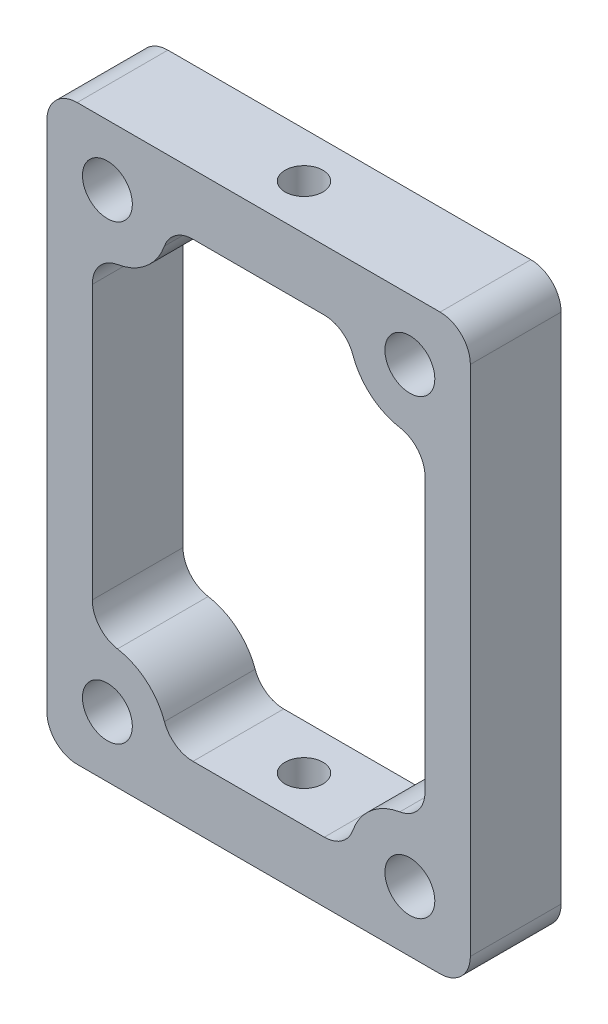
ISO-10303-21;
HEADER;
FILE_DESCRIPTION(('STEP AP214'),'2;1');
FILE_NAME('part.step','',(''),(''),'','','');
FILE_SCHEMA(('AUTOMOTIVE_DESIGN { 1 0 10303 214 1 1 1 1 }'));
ENDSEC;
DATA;
#1=APPLICATION_CONTEXT('core data for automotive mechanical design processes');
#2=APPLICATION_PROTOCOL_DEFINITION('international standard','automotive_design',2000,#1);
#3=PRODUCT_CONTEXT('',#1,'mechanical');
#4=PRODUCT('Part','Part','',(#3));
#5=PRODUCT_RELATED_PRODUCT_CATEGORY('part','',(#4));
#6=PRODUCT_DEFINITION_FORMATION('','',#4);
#7=PRODUCT_DEFINITION_CONTEXT('part definition',#1,'design');
#8=PRODUCT_DEFINITION('design','',#6,#7);
#9=PRODUCT_DEFINITION_SHAPE('','',#8);
#10=(LENGTH_UNIT() NAMED_UNIT(*) SI_UNIT(.MILLI.,.METRE.));
#11=(NAMED_UNIT(*) PLANE_ANGLE_UNIT() SI_UNIT($,.RADIAN.));
#12=(NAMED_UNIT(*) SI_UNIT($,.STERADIAN.) SOLID_ANGLE_UNIT());
#13=UNCERTAINTY_MEASURE_WITH_UNIT(LENGTH_MEASURE(1.E-05),#10,'distance_accuracy_value','');
#14=(GEOMETRIC_REPRESENTATION_CONTEXT(3) GLOBAL_UNCERTAINTY_ASSIGNED_CONTEXT((#13)) GLOBAL_UNIT_ASSIGNED_CONTEXT((#10,
#11,#12)) REPRESENTATION_CONTEXT('',''));
#15=CARTESIAN_POINT('',(0.,0.,0.));
#16=DIRECTION('',(0.,0.,1.));
#17=DIRECTION('',(1.,0.,0.));
#18=AXIS2_PLACEMENT_3D('',#15,#16,#17);
#19=CARTESIAN_POINT('',(0.,0.,3.));
#20=DIRECTION('',(0.,0.,-1.));
#21=DIRECTION('',(-1.,0.,0.));
#22=AXIS2_PLACEMENT_3D('',#19,#20,#21);
#23=PLANE('',#22);
#24=DIRECTION('',(1.,0.,0.));
#25=VECTOR('',#24,1.);
#26=CARTESIAN_POINT('',(-14.,-18.95,3.));
#27=LINE('',#26,#25);
#28=CARTESIAN_POINT('',(-12.,-18.95,3.));
#29=VERTEX_POINT('',#28);
#30=CARTESIAN_POINT('',(12.,-18.95,3.));
#31=VERTEX_POINT('',#30);
#32=EDGE_CURVE('E237',#29,#31,#27,.T.);
#33=ORIENTED_EDGE('',*,*,#32,.T.);
#34=CARTESIAN_POINT('',(12.,-16.95,3.));
#35=DIRECTION('',(0.,0.,-1.));
#36=DIRECTION('',(-1.,0.,0.));
#37=AXIS2_PLACEMENT_3D('',#34,#35,#36);
#38=CIRCLE('',#37,2.);
#39=CARTESIAN_POINT('',(14.,-16.95,3.));
#40=VERTEX_POINT('',#39);
#41=EDGE_CURVE('E274',#31,#40,#38,.F.);
#42=ORIENTED_EDGE('',*,*,#41,.T.);
#43=DIRECTION('',(0.,1.,0.));
#44=VECTOR('',#43,1.);
#45=CARTESIAN_POINT('',(14.,-18.95,3.));
#46=LINE('',#45,#44);
#47=CARTESIAN_POINT('',(14.,16.95,3.));
#48=VERTEX_POINT('',#47);
#49=EDGE_CURVE('E221',#40,#48,#46,.T.);
#50=ORIENTED_EDGE('',*,*,#49,.T.);
#51=CARTESIAN_POINT('',(12.,16.95,3.));
#52=DIRECTION('',(0.,0.,-1.));
#53=DIRECTION('',(-1.,0.,0.));
#54=AXIS2_PLACEMENT_3D('',#51,#52,#53);
#55=CIRCLE('',#54,2.);
#56=CARTESIAN_POINT('',(12.,18.95,3.));
#57=VERTEX_POINT('',#56);
#58=EDGE_CURVE('E268',#48,#57,#55,.F.);
#59=ORIENTED_EDGE('',*,*,#58,.T.);
#60=DIRECTION('',(-1.,0.,0.));
#61=VECTOR('',#60,1.);
#62=CARTESIAN_POINT('',(-14.,18.95,3.));
#63=LINE('',#62,#61);
#64=CARTESIAN_POINT('',(-12.,18.95,3.));
#65=VERTEX_POINT('',#64);
#66=EDGE_CURVE('E470',#57,#65,#63,.T.);
#67=ORIENTED_EDGE('',*,*,#66,.T.);
#68=CARTESIAN_POINT('',(-12.,16.95,3.));
#69=DIRECTION('',(0.,0.,-1.));
#70=DIRECTION('',(-1.,0.,0.));
#71=AXIS2_PLACEMENT_3D('',#68,#69,#70);
#72=CIRCLE('',#71,2.);
#73=CARTESIAN_POINT('',(-14.,16.95,3.));
#74=VERTEX_POINT('',#73);
#75=EDGE_CURVE('E270',#65,#74,#72,.F.);
#76=ORIENTED_EDGE('',*,*,#75,.T.);
#77=DIRECTION('',(0.,-1.,0.));
#78=VECTOR('',#77,1.);
#79=CARTESIAN_POINT('',(-14.,-18.95,3.));
#80=LINE('',#79,#78);
#81=CARTESIAN_POINT('',(-14.,-16.95,3.));
#82=VERTEX_POINT('',#81);
#83=EDGE_CURVE('E472',#74,#82,#80,.T.);
#84=ORIENTED_EDGE('',*,*,#83,.T.);
#85=CARTESIAN_POINT('',(-12.,-16.95,3.));
#86=DIRECTION('',(0.,0.,-1.));
#87=DIRECTION('',(-1.,0.,0.));
#88=AXIS2_PLACEMENT_3D('',#85,#86,#87);
#89=CIRCLE('',#88,2.);
#90=EDGE_CURVE('E272',#82,#29,#89,.F.);
#91=ORIENTED_EDGE('',*,*,#90,.T.);
#92=EDGE_LOOP('',(#33,#42,#50,#59,#67,#76,#84,#91));
#93=FACE_BOUND('',#92,.T.);
#94=CARTESIAN_POINT('',(-9.99999999999999,-14.95,3.));
#95=DIRECTION('',(0.,0.,1.));
#96=DIRECTION('',(1.,0.,0.));
#97=AXIS2_PLACEMENT_3D('',#94,#95,#96);
#98=CIRCLE('',#97,1.64999999999999);
#99=CARTESIAN_POINT('',(-8.35000000000001,-14.95,3.));
#100=VERTEX_POINT('',#99);
#101=EDGE_CURVE('E234',#100,#100,#98,.T.);
#102=ORIENTED_EDGE('',*,*,#101,.F.);
#103=EDGE_LOOP('',(#102));
#104=FACE_BOUND('',#103,.T.);
#105=CARTESIAN_POINT('',(9.99999999999999,-14.95,3.));
#106=DIRECTION('',(0.,0.,1.));
#107=DIRECTION('',(1.,0.,0.));
#108=AXIS2_PLACEMENT_3D('',#105,#106,#107);
#109=CIRCLE('',#108,1.64999999999999);
#110=CARTESIAN_POINT('',(11.65,-14.95,3.));
#111=VERTEX_POINT('',#110);
#112=EDGE_CURVE('E461',#111,#111,#109,.T.);
#113=ORIENTED_EDGE('',*,*,#112,.F.);
#114=EDGE_LOOP('',(#113));
#115=FACE_BOUND('',#114,.T.);
#116=CARTESIAN_POINT('',(9.99999999999999,14.95,3.));
#117=DIRECTION('',(0.,0.,1.));
#118=DIRECTION('',(1.,0.,0.));
#119=AXIS2_PLACEMENT_3D('',#116,#117,#118);
#120=CIRCLE('',#119,1.64999999999999);
#121=CARTESIAN_POINT('',(11.65,14.95,3.));
#122=VERTEX_POINT('',#121);
#123=EDGE_CURVE('E455',#122,#122,#120,.T.);
#124=ORIENTED_EDGE('',*,*,#123,.F.);
#125=EDGE_LOOP('',(#124));
#126=FACE_BOUND('',#125,.T.);
#127=CARTESIAN_POINT('',(-9.99999999999999,14.95,3.));
#128=DIRECTION('',(0.,0.,1.));
#129=DIRECTION('',(1.,0.,0.));
#130=AXIS2_PLACEMENT_3D('',#127,#128,#129);
#131=CIRCLE('',#130,1.64999999999999);
#132=CARTESIAN_POINT('',(-8.35000000000001,14.95,3.));
#133=VERTEX_POINT('',#132);
#134=EDGE_CURVE('E449',#133,#133,#131,.T.);
#135=ORIENTED_EDGE('',*,*,#134,.F.);
#136=EDGE_LOOP('',(#135));
#137=FACE_BOUND('',#136,.T.);
#138=DIRECTION('',(0.,-1.,0.));
#139=VECTOR('',#138,1.);
#140=CARTESIAN_POINT('',(-11.,11.0770166537926,3.));
#141=LINE('',#140,#139);
#142=CARTESIAN_POINT('',(-11.,9.03392021690037,3.));
#143=VERTEX_POINT('',#142);
#144=CARTESIAN_POINT('',(-11.,-9.03392021690038,3.));
#145=VERTEX_POINT('',#144);
#146=EDGE_CURVE('E363',#143,#145,#141,.T.);
#147=ORIENTED_EDGE('',*,*,#146,.F.);
#148=CARTESIAN_POINT('',(-8.99999999999999,9.03392021690037,3.));
#149=DIRECTION('',(0.,0.,-1.));
#150=DIRECTION('',(-1.,0.,0.));
#151=AXIS2_PLACEMENT_3D('',#148,#149,#150);
#152=CIRCLE('',#151,2.);
#153=CARTESIAN_POINT('',(-9.33333333333332,11.0059468112669,3.));
#154=VERTEX_POINT('',#153);
#155=EDGE_CURVE('E47',#143,#154,#152,.T.);
#156=ORIENTED_EDGE('',*,*,#155,.T.);
#157=CARTESIAN_POINT('',(-9.99999999999999,14.95,3.));
#158=DIRECTION('',(0.,0.,1.));
#159=DIRECTION('',(1.,0.,0.));
#160=AXIS2_PLACEMENT_3D('',#157,#158,#159);
#161=CIRCLE('',#160,4.00000000000001);
#162=CARTESIAN_POINT('',(-6.22876383367173,13.6166666666667,3.));
#163=VERTEX_POINT('',#162);
#164=EDGE_CURVE('E361',#154,#163,#161,.T.);
#165=ORIENTED_EDGE('',*,*,#164,.T.);
#166=CARTESIAN_POINT('',(-4.3431457505076,12.95,3.));
#167=DIRECTION('',(0.,0.,-1.));
#168=DIRECTION('',(-1.,0.,0.));
#169=AXIS2_PLACEMENT_3D('',#166,#167,#168);
#170=CIRCLE('',#169,2.);
#171=CARTESIAN_POINT('',(-4.3431457505076,14.95,3.));
#172=VERTEX_POINT('',#171);
#173=EDGE_CURVE('E355',#163,#172,#170,.T.);
#174=ORIENTED_EDGE('',*,*,#173,.T.);
#175=DIRECTION('',(1.,0.,0.));
#176=VECTOR('',#175,1.);
#177=CARTESIAN_POINT('',(0.,14.95,3.));
#178=LINE('',#177,#176);
#179=CARTESIAN_POINT('',(4.3431457505076,14.95,3.));
#180=VERTEX_POINT('',#179);
#181=EDGE_CURVE('E369',#172,#180,#178,.T.);
#182=ORIENTED_EDGE('',*,*,#181,.T.);
#183=CARTESIAN_POINT('',(4.3431457505076,12.95,3.));
#184=DIRECTION('',(0.,0.,-1.));
#185=DIRECTION('',(-1.,0.,0.));
#186=AXIS2_PLACEMENT_3D('',#183,#184,#185);
#187=CIRCLE('',#186,2.);
#188=CARTESIAN_POINT('',(6.22876383367173,13.6166666666667,3.));
#189=VERTEX_POINT('',#188);
#190=EDGE_CURVE('E331',#180,#189,#187,.T.);
#191=ORIENTED_EDGE('',*,*,#190,.T.);
#192=CARTESIAN_POINT('',(9.99999999999999,14.95,3.));
#193=DIRECTION('',(0.,0.,1.));
#194=DIRECTION('',(1.,0.,0.));
#195=AXIS2_PLACEMENT_3D('',#192,#193,#194);
#196=CIRCLE('',#195,4.00000000000001);
#197=CARTESIAN_POINT('',(9.33333333333332,11.0059468112669,3.));
#198=VERTEX_POINT('',#197);
#199=EDGE_CURVE('E431',#189,#198,#196,.T.);
#200=ORIENTED_EDGE('',*,*,#199,.T.);
#201=CARTESIAN_POINT('',(8.99999999999999,9.03392021690037,3.));
#202=DIRECTION('',(0.,0.,-1.));
#203=DIRECTION('',(-1.,0.,0.));
#204=AXIS2_PLACEMENT_3D('',#201,#202,#203);
#205=CIRCLE('',#204,2.);
#206=CARTESIAN_POINT('',(11.,9.03392021690037,3.));
#207=VERTEX_POINT('',#206);
#208=EDGE_CURVE('E335',#198,#207,#205,.T.);
#209=ORIENTED_EDGE('',*,*,#208,.T.);
#210=DIRECTION('',(0.,1.,0.));
#211=VECTOR('',#210,1.);
#212=CARTESIAN_POINT('',(11.,11.0770166537926,3.));
#213=LINE('',#212,#211);
#214=CARTESIAN_POINT('',(11.,-9.03392021690038,3.));
#215=VERTEX_POINT('',#214);
#216=EDGE_CURVE('E420',#215,#207,#213,.T.);
#217=ORIENTED_EDGE('',*,*,#216,.F.);
#218=CARTESIAN_POINT('',(8.99999999999999,-9.03392021690038,3.));
#219=DIRECTION('',(0.,0.,-1.));
#220=DIRECTION('',(-1.,0.,0.));
#221=AXIS2_PLACEMENT_3D('',#218,#219,#220);
#222=CIRCLE('',#221,2.);
#223=CARTESIAN_POINT('',(9.33333333333333,-11.0059468112669,3.));
#224=VERTEX_POINT('',#223);
#225=EDGE_CURVE('E339',#215,#224,#222,.T.);
#226=ORIENTED_EDGE('',*,*,#225,.T.);
#227=CARTESIAN_POINT('',(9.99999999999999,-14.95,3.));
#228=DIRECTION('',(0.,0.,1.));
#229=DIRECTION('',(1.,0.,0.));
#230=AXIS2_PLACEMENT_3D('',#227,#228,#229);
#231=CIRCLE('',#230,4.);
#232=CARTESIAN_POINT('',(6.22876383367174,-13.6166666666667,3.));
#233=VERTEX_POINT('',#232);
#234=EDGE_CURVE('E409',#224,#233,#231,.T.);
#235=ORIENTED_EDGE('',*,*,#234,.T.);
#236=CARTESIAN_POINT('',(4.34314575050761,-12.95,3.));
#237=DIRECTION('',(0.,0.,-1.));
#238=DIRECTION('',(-1.,0.,0.));
#239=AXIS2_PLACEMENT_3D('',#236,#237,#238);
#240=CIRCLE('',#239,2.);
#241=CARTESIAN_POINT('',(4.34314575050761,-14.95,3.));
#242=VERTEX_POINT('',#241);
#243=EDGE_CURVE('E343',#233,#242,#240,.T.);
#244=ORIENTED_EDGE('',*,*,#243,.T.);
#245=DIRECTION('',(1.,0.,0.));
#246=VECTOR('',#245,1.);
#247=CARTESIAN_POINT('',(0.,-14.95,3.));
#248=LINE('',#247,#246);
#249=CARTESIAN_POINT('',(-4.34314575050761,-14.95,3.));
#250=VERTEX_POINT('',#249);
#251=EDGE_CURVE('E398',#250,#242,#248,.T.);
#252=ORIENTED_EDGE('',*,*,#251,.F.);
#253=CARTESIAN_POINT('',(-4.34314575050761,-12.95,3.));
#254=DIRECTION('',(0.,0.,-1.));
#255=DIRECTION('',(-1.,0.,0.));
#256=AXIS2_PLACEMENT_3D('',#253,#254,#255);
#257=CIRCLE('',#256,2.);
#258=CARTESIAN_POINT('',(-6.22876383367174,-13.6166666666667,3.));
#259=VERTEX_POINT('',#258);
#260=EDGE_CURVE('E347',#250,#259,#257,.T.);
#261=ORIENTED_EDGE('',*,*,#260,.T.);
#262=CARTESIAN_POINT('',(-9.99999999999999,-14.95,3.));
#263=DIRECTION('',(0.,0.,1.));
#264=DIRECTION('',(1.,0.,0.));
#265=AXIS2_PLACEMENT_3D('',#262,#263,#264);
#266=CIRCLE('',#265,4.);
#267=CARTESIAN_POINT('',(-9.33333333333333,-11.0059468112669,3.));
#268=VERTEX_POINT('',#267);
#269=EDGE_CURVE('E368',#259,#268,#266,.T.);
#270=ORIENTED_EDGE('',*,*,#269,.T.);
#271=CARTESIAN_POINT('',(-8.99999999999999,-9.03392021690038,3.));
#272=DIRECTION('',(0.,0.,-1.));
#273=DIRECTION('',(-1.,0.,0.));
#274=AXIS2_PLACEMENT_3D('',#271,#272,#273);
#275=CIRCLE('',#274,2.);
#276=EDGE_CURVE('E351',#268,#145,#275,.T.);
#277=ORIENTED_EDGE('',*,*,#276,.T.);
#278=EDGE_LOOP('',(#147,#156,#165,#174,#182,#191,#200,#209,#217,#226,#235,#244,#252,#261,#270,#277));
#279=FACE_BOUND('',#278,.T.);
#280=ADVANCED_FACE('F38',(#93,#104,#115,#126,#137,#279),#23,.F.);
#281=CARTESIAN_POINT('',(0.,0.,-3.));
#282=DIRECTION('',(0.,0.,-1.));
#283=DIRECTION('',(-1.,0.,0.));
#284=AXIS2_PLACEMENT_3D('',#281,#282,#283);
#285=PLANE('',#284);
#286=DIRECTION('',(-1.,0.,0.));
#287=VECTOR('',#286,1.);
#288=CARTESIAN_POINT('',(0.,14.95,-3.));
#289=LINE('',#288,#287);
#290=CARTESIAN_POINT('',(4.3431457505076,14.95,-3.));
#291=VERTEX_POINT('',#290);
#292=CARTESIAN_POINT('',(-4.3431457505076,14.95,-3.));
#293=VERTEX_POINT('',#292);
#294=EDGE_CURVE('E247',#291,#293,#289,.T.);
#295=ORIENTED_EDGE('',*,*,#294,.T.);
#296=CARTESIAN_POINT('',(-4.3431457505076,12.95,-3.));
#297=DIRECTION('',(0.,0.,-1.));
#298=DIRECTION('',(-1.,0.,0.));
#299=AXIS2_PLACEMENT_3D('',#296,#297,#298);
#300=CIRCLE('',#299,2.);
#301=CARTESIAN_POINT('',(-6.22876383367173,13.6166666666667,-3.));
#302=VERTEX_POINT('',#301);
#303=EDGE_CURVE('E61',#293,#302,#300,.F.);
#304=ORIENTED_EDGE('',*,*,#303,.T.);
#305=CARTESIAN_POINT('',(-9.99999999999999,14.95,-3.));
#306=DIRECTION('',(0.,0.,-1.));
#307=DIRECTION('',(-1.,0.,0.));
#308=AXIS2_PLACEMENT_3D('',#305,#306,#307);
#309=CIRCLE('',#308,4.00000000000001);
#310=CARTESIAN_POINT('',(-9.33333333333332,11.0059468112669,-3.));
#311=VERTEX_POINT('',#310);
#312=EDGE_CURVE('E249',#302,#311,#309,.T.);
#313=ORIENTED_EDGE('',*,*,#312,.T.);
#314=CARTESIAN_POINT('',(-8.99999999999999,9.03392021690037,-3.));
#315=DIRECTION('',(0.,0.,-1.));
#316=DIRECTION('',(-1.,0.,0.));
#317=AXIS2_PLACEMENT_3D('',#314,#315,#316);
#318=CIRCLE('',#317,2.);
#319=CARTESIAN_POINT('',(-11.,9.03392021690037,-3.));
#320=VERTEX_POINT('',#319);
#321=EDGE_CURVE('E11',#311,#320,#318,.F.);
#322=ORIENTED_EDGE('',*,*,#321,.T.);
#323=DIRECTION('',(0.,1.,0.));
#324=VECTOR('',#323,1.);
#325=CARTESIAN_POINT('',(-11.,0.,-3.));
#326=LINE('',#325,#324);
#327=CARTESIAN_POINT('',(-11.,-9.03392021690038,-3.));
#328=VERTEX_POINT('',#327);
#329=EDGE_CURVE('E289',#328,#320,#326,.T.);
#330=ORIENTED_EDGE('',*,*,#329,.F.);
#331=CARTESIAN_POINT('',(-8.99999999999999,-9.03392021690038,-3.));
#332=DIRECTION('',(0.,0.,-1.));
#333=DIRECTION('',(-1.,0.,0.));
#334=AXIS2_PLACEMENT_3D('',#331,#332,#333);
#335=CIRCLE('',#334,2.);
#336=CARTESIAN_POINT('',(-9.33333333333333,-11.0059468112669,-3.));
#337=VERTEX_POINT('',#336);
#338=EDGE_CURVE('E353',#328,#337,#335,.F.);
#339=ORIENTED_EDGE('',*,*,#338,.T.);
#340=CARTESIAN_POINT('',(-9.99999999999999,-14.95,-3.));
#341=DIRECTION('',(0.,0.,-1.));
#342=DIRECTION('',(-1.,0.,0.));
#343=AXIS2_PLACEMENT_3D('',#340,#341,#342);
#344=CIRCLE('',#343,4.);
#345=CARTESIAN_POINT('',(-6.22876383367174,-13.6166666666667,-3.));
#346=VERTEX_POINT('',#345);
#347=EDGE_CURVE('E251',#337,#346,#344,.T.);
#348=ORIENTED_EDGE('',*,*,#347,.T.);
#349=CARTESIAN_POINT('',(-4.34314575050761,-12.95,-3.));
#350=DIRECTION('',(0.,0.,-1.));
#351=DIRECTION('',(-1.,0.,0.));
#352=AXIS2_PLACEMENT_3D('',#349,#350,#351);
#353=CIRCLE('',#352,2.);
#354=CARTESIAN_POINT('',(-4.34314575050761,-14.95,-3.));
#355=VERTEX_POINT('',#354);
#356=EDGE_CURVE('E349',#346,#355,#353,.F.);
#357=ORIENTED_EDGE('',*,*,#356,.T.);
#358=DIRECTION('',(-1.,0.,0.));
#359=VECTOR('',#358,1.);
#360=CARTESIAN_POINT('',(0.,-14.95,-3.));
#361=LINE('',#360,#359);
#362=CARTESIAN_POINT('',(4.34314575050761,-14.95,-3.));
#363=VERTEX_POINT('',#362);
#364=EDGE_CURVE('E254',#363,#355,#361,.T.);
#365=ORIENTED_EDGE('',*,*,#364,.F.);
#366=CARTESIAN_POINT('',(4.34314575050761,-12.95,-3.));
#367=DIRECTION('',(0.,0.,-1.));
#368=DIRECTION('',(-1.,0.,0.));
#369=AXIS2_PLACEMENT_3D('',#366,#367,#368);
#370=CIRCLE('',#369,2.);
#371=CARTESIAN_POINT('',(6.22876383367174,-13.6166666666667,-3.));
#372=VERTEX_POINT('',#371);
#373=EDGE_CURVE('E345',#363,#372,#370,.F.);
#374=ORIENTED_EDGE('',*,*,#373,.T.);
#375=CARTESIAN_POINT('',(9.99999999999999,-14.95,-3.));
#376=DIRECTION('',(0.,0.,-1.));
#377=DIRECTION('',(-1.,0.,0.));
#378=AXIS2_PLACEMENT_3D('',#375,#376,#377);
#379=CIRCLE('',#378,4.);
#380=CARTESIAN_POINT('',(9.33333333333333,-11.0059468112669,-3.));
#381=VERTEX_POINT('',#380);
#382=EDGE_CURVE('E257',#372,#381,#379,.T.);
#383=ORIENTED_EDGE('',*,*,#382,.T.);
#384=CARTESIAN_POINT('',(8.99999999999999,-9.03392021690038,-3.));
#385=DIRECTION('',(0.,0.,-1.));
#386=DIRECTION('',(-1.,0.,0.));
#387=AXIS2_PLACEMENT_3D('',#384,#385,#386);
#388=CIRCLE('',#387,2.);
#389=CARTESIAN_POINT('',(11.,-9.03392021690038,-3.));
#390=VERTEX_POINT('',#389);
#391=EDGE_CURVE('E341',#381,#390,#388,.F.);
#392=ORIENTED_EDGE('',*,*,#391,.T.);
#393=DIRECTION('',(0.,-1.,0.));
#394=VECTOR('',#393,1.);
#395=CARTESIAN_POINT('',(11.,0.,-3.));
#396=LINE('',#395,#394);
#397=CARTESIAN_POINT('',(11.,9.03392021690037,-3.));
#398=VERTEX_POINT('',#397);
#399=EDGE_CURVE('E286',#398,#390,#396,.T.);
#400=ORIENTED_EDGE('',*,*,#399,.F.);
#401=CARTESIAN_POINT('',(8.99999999999999,9.03392021690037,-3.));
#402=DIRECTION('',(0.,0.,-1.));
#403=DIRECTION('',(-1.,0.,0.));
#404=AXIS2_PLACEMENT_3D('',#401,#402,#403);
#405=CIRCLE('',#404,2.);
#406=CARTESIAN_POINT('',(9.33333333333332,11.0059468112669,-3.));
#407=VERTEX_POINT('',#406);
#408=EDGE_CURVE('E337',#398,#407,#405,.F.);
#409=ORIENTED_EDGE('',*,*,#408,.T.);
#410=CARTESIAN_POINT('',(9.99999999999999,14.95,-3.));
#411=DIRECTION('',(0.,0.,-1.));
#412=DIRECTION('',(-1.,0.,0.));
#413=AXIS2_PLACEMENT_3D('',#410,#411,#412);
#414=CIRCLE('',#413,4.00000000000001);
#415=CARTESIAN_POINT('',(6.22876383367173,13.6166666666667,-3.));
#416=VERTEX_POINT('',#415);
#417=EDGE_CURVE('E244',#407,#416,#414,.T.);
#418=ORIENTED_EDGE('',*,*,#417,.T.);
#419=CARTESIAN_POINT('',(4.3431457505076,12.95,-3.));
#420=DIRECTION('',(0.,0.,-1.));
#421=DIRECTION('',(-1.,0.,0.));
#422=AXIS2_PLACEMENT_3D('',#419,#420,#421);
#423=CIRCLE('',#422,2.);
#424=EDGE_CURVE('E333',#416,#291,#423,.F.);
#425=ORIENTED_EDGE('',*,*,#424,.T.);
#426=EDGE_LOOP('',(#295,#304,#313,#322,#330,#339,#348,#357,#365,#374,#383,#392,#400,#409,#418,#425));
#427=FACE_BOUND('',#426,.T.);
#428=CARTESIAN_POINT('',(-9.99999999999999,14.95,-3.));
#429=DIRECTION('',(0.,0.,1.));
#430=DIRECTION('',(1.,0.,0.));
#431=AXIS2_PLACEMENT_3D('',#428,#429,#430);
#432=CIRCLE('',#431,1.65);
#433=CARTESIAN_POINT('',(-8.35,14.95,-3.));
#434=VERTEX_POINT('',#433);
#435=EDGE_CURVE('E452',#434,#434,#432,.T.);
#436=ORIENTED_EDGE('',*,*,#435,.T.);
#437=EDGE_LOOP('',(#436));
#438=FACE_BOUND('',#437,.T.);
#439=CARTESIAN_POINT('',(9.99999999999999,14.95,-3.));
#440=DIRECTION('',(0.,0.,1.));
#441=DIRECTION('',(1.,0.,0.));
#442=AXIS2_PLACEMENT_3D('',#439,#440,#441);
#443=CIRCLE('',#442,1.65);
#444=CARTESIAN_POINT('',(11.65,14.95,-3.));
#445=VERTEX_POINT('',#444);
#446=EDGE_CURVE('E458',#445,#445,#443,.T.);
#447=ORIENTED_EDGE('',*,*,#446,.T.);
#448=EDGE_LOOP('',(#447));
#449=FACE_BOUND('',#448,.T.);
#450=CARTESIAN_POINT('',(9.99999999999999,-14.95,-3.));
#451=DIRECTION('',(0.,0.,1.));
#452=DIRECTION('',(1.,0.,0.));
#453=AXIS2_PLACEMENT_3D('',#450,#451,#452);
#454=CIRCLE('',#453,1.65);
#455=CARTESIAN_POINT('',(11.65,-14.95,-3.));
#456=VERTEX_POINT('',#455);
#457=EDGE_CURVE('E464',#456,#456,#454,.T.);
#458=ORIENTED_EDGE('',*,*,#457,.T.);
#459=EDGE_LOOP('',(#458));
#460=FACE_BOUND('',#459,.T.);
#461=CARTESIAN_POINT('',(-9.99999999999999,-14.95,-3.));
#462=DIRECTION('',(0.,0.,1.));
#463=DIRECTION('',(1.,0.,0.));
#464=AXIS2_PLACEMENT_3D('',#461,#462,#463);
#465=CIRCLE('',#464,1.65);
#466=CARTESIAN_POINT('',(-8.35,-14.95,-3.));
#467=VERTEX_POINT('',#466);
#468=EDGE_CURVE('E228',#467,#467,#465,.T.);
#469=ORIENTED_EDGE('',*,*,#468,.T.);
#470=EDGE_LOOP('',(#469));
#471=FACE_BOUND('',#470,.T.);
#472=DIRECTION('',(0.,1.,0.));
#473=VECTOR('',#472,1.);
#474=CARTESIAN_POINT('',(14.,-18.95,-3.));
#475=LINE('',#474,#473);
#476=CARTESIAN_POINT('',(14.,-16.95,-3.));
#477=VERTEX_POINT('',#476);
#478=CARTESIAN_POINT('',(14.,16.95,-3.));
#479=VERTEX_POINT('',#478);
#480=EDGE_CURVE('E218',#477,#479,#475,.T.);
#481=ORIENTED_EDGE('',*,*,#480,.F.);
#482=CARTESIAN_POINT('',(12.,-16.95,-3.));
#483=DIRECTION('',(0.,0.,-1.));
#484=DIRECTION('',(-1.,0.,0.));
#485=AXIS2_PLACEMENT_3D('',#482,#483,#484);
#486=CIRCLE('',#485,2.);
#487=CARTESIAN_POINT('',(12.,-18.95,-3.));
#488=VERTEX_POINT('',#487);
#489=EDGE_CURVE('E201',#477,#488,#486,.T.);
#490=ORIENTED_EDGE('',*,*,#489,.T.);
#491=DIRECTION('',(1.,0.,0.));
#492=VECTOR('',#491,1.);
#493=CARTESIAN_POINT('',(-14.,-18.95,-3.));
#494=LINE('',#493,#492);
#495=CARTESIAN_POINT('',(-12.,-18.95,-3.));
#496=VERTEX_POINT('',#495);
#497=EDGE_CURVE('E242',#496,#488,#494,.T.);
#498=ORIENTED_EDGE('',*,*,#497,.F.);
#499=CARTESIAN_POINT('',(-12.,-16.95,-3.));
#500=DIRECTION('',(0.,0.,-1.));
#501=DIRECTION('',(-1.,0.,0.));
#502=AXIS2_PLACEMENT_3D('',#499,#500,#501);
#503=CIRCLE('',#502,2.);
#504=CARTESIAN_POINT('',(-14.,-16.95,-3.));
#505=VERTEX_POINT('',#504);
#506=EDGE_CURVE('E212',#496,#505,#503,.T.);
#507=ORIENTED_EDGE('',*,*,#506,.T.);
#508=DIRECTION('',(0.,-1.,0.));
#509=VECTOR('',#508,1.);
#510=CARTESIAN_POINT('',(-14.,-18.95,-3.));
#511=LINE('',#510,#509);
#512=CARTESIAN_POINT('',(-14.,16.95,-3.));
#513=VERTEX_POINT('',#512);
#514=EDGE_CURVE('E231',#513,#505,#511,.T.);
#515=ORIENTED_EDGE('',*,*,#514,.F.);
#516=CARTESIAN_POINT('',(-12.,16.95,-3.));
#517=DIRECTION('',(0.,0.,-1.));
#518=DIRECTION('',(-1.,0.,0.));
#519=AXIS2_PLACEMENT_3D('',#516,#517,#518);
#520=CIRCLE('',#519,2.);
#521=CARTESIAN_POINT('',(-12.,18.95,-3.));
#522=VERTEX_POINT('',#521);
#523=EDGE_CURVE('E262',#513,#522,#520,.T.);
#524=ORIENTED_EDGE('',*,*,#523,.T.);
#525=DIRECTION('',(-1.,0.,0.));
#526=VECTOR('',#525,1.);
#527=CARTESIAN_POINT('',(-14.,18.95,-3.));
#528=LINE('',#527,#526);
#529=CARTESIAN_POINT('',(12.,18.95,-3.));
#530=VERTEX_POINT('',#529);
#531=EDGE_CURVE('E227',#530,#522,#528,.T.);
#532=ORIENTED_EDGE('',*,*,#531,.F.);
#533=CARTESIAN_POINT('',(12.,16.95,-3.));
#534=DIRECTION('',(0.,0.,-1.));
#535=DIRECTION('',(-1.,0.,0.));
#536=AXIS2_PLACEMENT_3D('',#533,#534,#535);
#537=CIRCLE('',#536,2.);
#538=EDGE_CURVE('E222',#530,#479,#537,.T.);
#539=ORIENTED_EDGE('',*,*,#538,.T.);
#540=EDGE_LOOP('',(#481,#490,#498,#507,#515,#524,#532,#539));
#541=FACE_BOUND('',#540,.T.);
#542=ADVANCED_FACE('F225',(#427,#438,#449,#460,#471,#541),#285,.T.);
#543=CARTESIAN_POINT('',(14.,-18.95,3.));
#544=DIRECTION('',(-1.,0.,0.));
#545=DIRECTION('',(0.,0.,1.));
#546=AXIS2_PLACEMENT_3D('',#543,#544,#545);
#547=PLANE('',#546);
#548=ORIENTED_EDGE('',*,*,#49,.F.);
#549=DIRECTION('',(0.,0.,-1.));
#550=VECTOR('',#549,1.);
#551=CARTESIAN_POINT('',(14.,-16.95,3.));
#552=LINE('',#551,#550);
#553=EDGE_CURVE('E205',#40,#477,#552,.T.);
#554=ORIENTED_EDGE('',*,*,#553,.T.);
#555=ORIENTED_EDGE('',*,*,#480,.T.);
#556=DIRECTION('',(0.,0.,-1.));
#557=VECTOR('',#556,1.);
#558=CARTESIAN_POINT('',(14.,16.95,3.));
#559=LINE('',#558,#557);
#560=EDGE_CURVE('E223',#479,#48,#559,.F.);
#561=ORIENTED_EDGE('',*,*,#560,.T.);
#562=EDGE_LOOP('',(#548,#554,#555,#561));
#563=FACE_BOUND('',#562,.T.);
#564=ADVANCED_FACE('F217',(#563),#547,.F.);
#565=CARTESIAN_POINT('',(-14.,18.95,3.));
#566=DIRECTION('',(0.,-1.,0.));
#567=DIRECTION('',(0.,0.,-1.));
#568=AXIS2_PLACEMENT_3D('',#565,#566,#567);
#569=PLANE('',#568);
#570=CARTESIAN_POINT('',(0.,18.95,0.));
#571=DIRECTION('',(0.,1.,0.));
#572=DIRECTION('',(0.,0.,1.));
#573=AXIS2_PLACEMENT_3D('',#570,#571,#572);
#574=CIRCLE('',#573,1.25);
#575=CARTESIAN_POINT('',(0.,18.95,1.25));
#576=VERTEX_POINT('',#575);
#577=EDGE_CURVE('E819',#576,#576,#574,.T.);
#578=ORIENTED_EDGE('',*,*,#577,.F.);
#579=EDGE_LOOP('',(#578));
#580=FACE_BOUND('',#579,.T.);
#581=ORIENTED_EDGE('',*,*,#531,.T.);
#582=DIRECTION('',(0.,0.,-1.));
#583=VECTOR('',#582,1.);
#584=CARTESIAN_POINT('',(-12.,18.95,3.));
#585=LINE('',#584,#583);
#586=EDGE_CURVE('E284',#522,#65,#585,.F.);
#587=ORIENTED_EDGE('',*,*,#586,.T.);
#588=ORIENTED_EDGE('',*,*,#66,.F.);
#589=DIRECTION('',(0.,0.,-1.));
#590=VECTOR('',#589,1.);
#591=CARTESIAN_POINT('',(12.,18.95,3.));
#592=LINE('',#591,#590);
#593=EDGE_CURVE('E281',#57,#530,#592,.T.);
#594=ORIENTED_EDGE('',*,*,#593,.T.);
#595=EDGE_LOOP('',(#581,#587,#588,#594));
#596=FACE_BOUND('',#595,.T.);
#597=ADVANCED_FACE('F495',(#580,#596),#569,.F.);
#598=CARTESIAN_POINT('',(-14.,-18.95,3.));
#599=DIRECTION('',(1.,0.,0.));
#600=DIRECTION('',(0.,0.,-1.));
#601=AXIS2_PLACEMENT_3D('',#598,#599,#600);
#602=PLANE('',#601);
#603=ORIENTED_EDGE('',*,*,#514,.T.);
#604=DIRECTION('',(0.,0.,-1.));
#605=VECTOR('',#604,1.);
#606=CARTESIAN_POINT('',(-14.,-16.95,3.));
#607=LINE('',#606,#605);
#608=EDGE_CURVE('E279',#505,#82,#607,.F.);
#609=ORIENTED_EDGE('',*,*,#608,.T.);
#610=ORIENTED_EDGE('',*,*,#83,.F.);
#611=DIRECTION('',(0.,0.,-1.));
#612=VECTOR('',#611,1.);
#613=CARTESIAN_POINT('',(-14.,16.95,3.));
#614=LINE('',#613,#612);
#615=EDGE_CURVE('E276',#74,#513,#614,.T.);
#616=ORIENTED_EDGE('',*,*,#615,.T.);
#617=EDGE_LOOP('',(#603,#609,#610,#616));
#618=FACE_BOUND('',#617,.T.);
#619=ADVANCED_FACE('F488',(#618),#602,.F.);
#620=CARTESIAN_POINT('',(-14.,-18.95,3.));
#621=DIRECTION('',(0.,1.,0.));
#622=DIRECTION('',(0.,0.,1.));
#623=AXIS2_PLACEMENT_3D('',#620,#621,#622);
#624=PLANE('',#623);
#625=CARTESIAN_POINT('',(0.,-18.95,0.));
#626=DIRECTION('',(0.,1.,0.));
#627=DIRECTION('',(0.,0.,1.));
#628=AXIS2_PLACEMENT_3D('',#625,#626,#627);
#629=CIRCLE('',#628,1.24999999999999);
#630=CARTESIAN_POINT('',(0.,-18.95,1.24999999999999));
#631=VERTEX_POINT('',#630);
#632=EDGE_CURVE('E809',#631,#631,#629,.T.);
#633=ORIENTED_EDGE('',*,*,#632,.T.);
#634=EDGE_LOOP('',(#633));
#635=FACE_BOUND('',#634,.T.);
#636=ORIENTED_EDGE('',*,*,#497,.T.);
#637=DIRECTION('',(0.,0.,-1.));
#638=VECTOR('',#637,1.);
#639=CARTESIAN_POINT('',(12.,-18.95,3.));
#640=LINE('',#639,#638);
#641=EDGE_CURVE('E206',#488,#31,#640,.F.);
#642=ORIENTED_EDGE('',*,*,#641,.T.);
#643=ORIENTED_EDGE('',*,*,#32,.F.);
#644=DIRECTION('',(0.,0.,-1.));
#645=VECTOR('',#644,1.);
#646=CARTESIAN_POINT('',(-12.,-18.95,3.));
#647=LINE('',#646,#645);
#648=EDGE_CURVE('E211',#29,#496,#647,.T.);
#649=ORIENTED_EDGE('',*,*,#648,.T.);
#650=EDGE_LOOP('',(#636,#642,#643,#649));
#651=FACE_BOUND('',#650,.T.);
#652=ADVANCED_FACE('F482',(#635,#651),#624,.F.);
#653=CARTESIAN_POINT('',(-9.99999999999999,-14.95,3.));
#654=DIRECTION('',(0.,0.,1.));
#655=DIRECTION('',(1.,0.,0.));
#656=AXIS2_PLACEMENT_3D('',#653,#654,#655);
#657=CYLINDRICAL_SURFACE('',#656,1.64999999999999);
#658=ORIENTED_EDGE('',*,*,#468,.F.);
#659=EDGE_LOOP('',(#658));
#660=FACE_BOUND('',#659,.T.);
#661=ORIENTED_EDGE('',*,*,#101,.T.);
#662=EDGE_LOOP('',(#661));
#663=FACE_BOUND('',#662,.T.);
#664=ADVANCED_FACE('F517',(#660,#663),#657,.F.);
#665=CARTESIAN_POINT('',(9.99999999999999,-14.95,3.));
#666=DIRECTION('',(0.,0.,1.));
#667=DIRECTION('',(1.,0.,0.));
#668=AXIS2_PLACEMENT_3D('',#665,#666,#667);
#669=CYLINDRICAL_SURFACE('',#668,1.64999999999999);
#670=ORIENTED_EDGE('',*,*,#457,.F.);
#671=EDGE_LOOP('',(#670));
#672=FACE_BOUND('',#671,.T.);
#673=ORIENTED_EDGE('',*,*,#112,.T.);
#674=EDGE_LOOP('',(#673));
#675=FACE_BOUND('',#674,.T.);
#676=ADVANCED_FACE('F738',(#672,#675),#669,.F.);
#677=CARTESIAN_POINT('',(9.99999999999999,14.95,3.));
#678=DIRECTION('',(0.,0.,1.));
#679=DIRECTION('',(1.,0.,0.));
#680=AXIS2_PLACEMENT_3D('',#677,#678,#679);
#681=CYLINDRICAL_SURFACE('',#680,1.64999999999999);
#682=ORIENTED_EDGE('',*,*,#446,.F.);
#683=EDGE_LOOP('',(#682));
#684=FACE_BOUND('',#683,.T.);
#685=ORIENTED_EDGE('',*,*,#123,.T.);
#686=EDGE_LOOP('',(#685));
#687=FACE_BOUND('',#686,.T.);
#688=ADVANCED_FACE('F735',(#684,#687),#681,.F.);
#689=CARTESIAN_POINT('',(-9.99999999999999,14.95,3.));
#690=DIRECTION('',(0.,0.,1.));
#691=DIRECTION('',(1.,0.,0.));
#692=AXIS2_PLACEMENT_3D('',#689,#690,#691);
#693=CYLINDRICAL_SURFACE('',#692,1.64999999999999);
#694=ORIENTED_EDGE('',*,*,#435,.F.);
#695=EDGE_LOOP('',(#694));
#696=FACE_BOUND('',#695,.T.);
#697=ORIENTED_EDGE('',*,*,#134,.T.);
#698=EDGE_LOOP('',(#697));
#699=FACE_BOUND('',#698,.T.);
#700=ADVANCED_FACE('F567',(#696,#699),#693,.F.);
#701=CARTESIAN_POINT('',(9.99999999999999,-14.95,-5.));
#702=DIRECTION('',(0.,0.,1.));
#703=DIRECTION('',(1.,0.,0.));
#704=AXIS2_PLACEMENT_3D('',#701,#702,#703);
#705=CYLINDRICAL_SURFACE('',#704,4.);
#706=ORIENTED_EDGE('',*,*,#234,.F.);
#707=DIRECTION('',(0.,0.,1.));
#708=VECTOR('',#707,1.);
#709=CARTESIAN_POINT('',(9.33333333333333,-11.0059468112669,-5.));
#710=LINE('',#709,#708);
#711=EDGE_CURVE('E310',#224,#381,#710,.F.);
#712=ORIENTED_EDGE('',*,*,#711,.T.);
#713=ORIENTED_EDGE('',*,*,#382,.F.);
#714=DIRECTION('',(0.,0.,1.));
#715=VECTOR('',#714,1.);
#716=CARTESIAN_POINT('',(6.22876383367174,-13.6166666666667,-5.));
#717=LINE('',#716,#715);
#718=EDGE_CURVE('E307',#372,#233,#717,.T.);
#719=ORIENTED_EDGE('',*,*,#718,.T.);
#720=EDGE_LOOP('',(#706,#712,#713,#719));
#721=FACE_BOUND('',#720,.T.);
#722=ADVANCED_FACE('F406',(#721),#705,.T.);
#723=CARTESIAN_POINT('',(0.,-14.95,-5.));
#724=DIRECTION('',(0.,-1.,0.));
#725=DIRECTION('',(0.,0.,-1.));
#726=AXIS2_PLACEMENT_3D('',#723,#724,#725);
#727=PLANE('',#726);
#728=CARTESIAN_POINT('',(0.,-14.95,0.));
#729=DIRECTION('',(0.,-1.,0.));
#730=DIRECTION('',(0.,0.,-1.));
#731=AXIS2_PLACEMENT_3D('',#728,#729,#730);
#732=CIRCLE('',#731,1.25);
#733=CARTESIAN_POINT('',(0.,-14.95,-1.25));
#734=VERTEX_POINT('',#733);
#735=EDGE_CURVE('E812',#734,#734,#732,.T.);
#736=ORIENTED_EDGE('',*,*,#735,.T.);
#737=EDGE_LOOP('',(#736));
#738=FACE_BOUND('',#737,.T.);
#739=ORIENTED_EDGE('',*,*,#251,.T.);
#740=DIRECTION('',(0.,0.,1.));
#741=VECTOR('',#740,1.);
#742=CARTESIAN_POINT('',(4.34314575050761,-14.95,-5.));
#743=LINE('',#742,#741);
#744=EDGE_CURVE('E315',#242,#363,#743,.F.);
#745=ORIENTED_EDGE('',*,*,#744,.T.);
#746=ORIENTED_EDGE('',*,*,#364,.T.);
#747=DIRECTION('',(0.,0.,1.));
#748=VECTOR('',#747,1.);
#749=CARTESIAN_POINT('',(-4.34314575050761,-14.95,-5.));
#750=LINE('',#749,#748);
#751=EDGE_CURVE('E312',#355,#250,#750,.T.);
#752=ORIENTED_EDGE('',*,*,#751,.T.);
#753=EDGE_LOOP('',(#739,#745,#746,#752));
#754=FACE_BOUND('',#753,.T.);
#755=ADVANCED_FACE('F395',(#738,#754),#727,.F.);
#756=CARTESIAN_POINT('',(-9.99999999999999,-14.95,-5.));
#757=DIRECTION('',(0.,0.,1.));
#758=DIRECTION('',(1.,0.,0.));
#759=AXIS2_PLACEMENT_3D('',#756,#757,#758);
#760=CYLINDRICAL_SURFACE('',#759,4.);
#761=ORIENTED_EDGE('',*,*,#269,.F.);
#762=DIRECTION('',(0.,0.,1.));
#763=VECTOR('',#762,1.);
#764=CARTESIAN_POINT('',(-6.22876383367174,-13.6166666666667,-5.));
#765=LINE('',#764,#763);
#766=EDGE_CURVE('E320',#259,#346,#765,.F.);
#767=ORIENTED_EDGE('',*,*,#766,.T.);
#768=ORIENTED_EDGE('',*,*,#347,.F.);
#769=DIRECTION('',(0.,0.,1.));
#770=VECTOR('',#769,1.);
#771=CARTESIAN_POINT('',(-9.33333333333333,-11.0059468112669,-5.));
#772=LINE('',#771,#770);
#773=EDGE_CURVE('E317',#337,#268,#772,.T.);
#774=ORIENTED_EDGE('',*,*,#773,.T.);
#775=EDGE_LOOP('',(#761,#767,#768,#774));
#776=FACE_BOUND('',#775,.T.);
#777=ADVANCED_FACE('F385',(#776),#760,.T.);
#778=CARTESIAN_POINT('',(-9.99999999999999,14.95,-5.));
#779=DIRECTION('',(0.,0.,1.));
#780=DIRECTION('',(1.,0.,0.));
#781=AXIS2_PLACEMENT_3D('',#778,#779,#780);
#782=CYLINDRICAL_SURFACE('',#781,4.00000000000001);
#783=ORIENTED_EDGE('',*,*,#312,.F.);
#784=DIRECTION('',(0.,0.,1.));
#785=VECTOR('',#784,1.);
#786=CARTESIAN_POINT('',(-6.22876383367173,13.6166666666667,-5.));
#787=LINE('',#786,#785);
#788=EDGE_CURVE('E328',#302,#163,#787,.T.);
#789=ORIENTED_EDGE('',*,*,#788,.T.);
#790=ORIENTED_EDGE('',*,*,#164,.F.);
#791=DIRECTION('',(0.,0.,1.));
#792=VECTOR('',#791,1.);
#793=CARTESIAN_POINT('',(-9.33333333333332,11.0059468112669,-5.));
#794=LINE('',#793,#792);
#795=EDGE_CURVE('E54',#154,#311,#794,.F.);
#796=ORIENTED_EDGE('',*,*,#795,.T.);
#797=EDGE_LOOP('',(#783,#789,#790,#796));
#798=FACE_BOUND('',#797,.T.);
#799=ADVANCED_FACE('F366',(#798),#782,.T.);
#800=CARTESIAN_POINT('',(0.,14.95,-5.));
#801=DIRECTION('',(0.,-1.,0.));
#802=DIRECTION('',(0.,0.,-1.));
#803=AXIS2_PLACEMENT_3D('',#800,#801,#802);
#804=PLANE('',#803);
#805=CARTESIAN_POINT('',(0.,14.95,0.));
#806=DIRECTION('',(0.,-1.,0.));
#807=DIRECTION('',(0.,0.,-1.));
#808=AXIS2_PLACEMENT_3D('',#805,#806,#807);
#809=CIRCLE('',#808,1.25);
#810=CARTESIAN_POINT('',(0.,14.95,-1.25));
#811=VERTEX_POINT('',#810);
#812=EDGE_CURVE('E42',#811,#811,#809,.T.);
#813=ORIENTED_EDGE('',*,*,#812,.F.);
#814=EDGE_LOOP('',(#813));
#815=FACE_BOUND('',#814,.T.);
#816=ORIENTED_EDGE('',*,*,#294,.F.);
#817=DIRECTION('',(0.,0.,-1.));
#818=VECTOR('',#817,1.);
#819=CARTESIAN_POINT('',(4.3431457505076,14.95,3.));
#820=LINE('',#819,#818);
#821=EDGE_CURVE('E294',#291,#180,#820,.F.);
#822=ORIENTED_EDGE('',*,*,#821,.T.);
#823=ORIENTED_EDGE('',*,*,#181,.F.);
#824=DIRECTION('',(0.,0.,-1.));
#825=VECTOR('',#824,1.);
#826=CARTESIAN_POINT('',(-4.3431457505076,14.95,-3.));
#827=LINE('',#826,#825);
#828=EDGE_CURVE('E292',#172,#293,#827,.T.);
#829=ORIENTED_EDGE('',*,*,#828,.T.);
#830=EDGE_LOOP('',(#816,#822,#823,#829));
#831=FACE_BOUND('',#830,.T.);
#832=ADVANCED_FACE('F437',(#815,#831),#804,.T.);
#833=CARTESIAN_POINT('',(9.99999999999999,14.95,-5.));
#834=DIRECTION('',(0.,0.,1.));
#835=DIRECTION('',(1.,0.,0.));
#836=AXIS2_PLACEMENT_3D('',#833,#834,#835);
#837=CYLINDRICAL_SURFACE('',#836,4.00000000000001);
#838=ORIENTED_EDGE('',*,*,#199,.F.);
#839=DIRECTION('',(0.,0.,1.));
#840=VECTOR('',#839,1.);
#841=CARTESIAN_POINT('',(6.22876383367173,13.6166666666667,-5.));
#842=LINE('',#841,#840);
#843=EDGE_CURVE('E300',#189,#416,#842,.F.);
#844=ORIENTED_EDGE('',*,*,#843,.T.);
#845=ORIENTED_EDGE('',*,*,#417,.F.);
#846=DIRECTION('',(0.,0.,1.));
#847=VECTOR('',#846,1.);
#848=CARTESIAN_POINT('',(9.33333333333332,11.0059468112669,-5.));
#849=LINE('',#848,#847);
#850=EDGE_CURVE('E297',#407,#198,#849,.T.);
#851=ORIENTED_EDGE('',*,*,#850,.T.);
#852=EDGE_LOOP('',(#838,#844,#845,#851));
#853=FACE_BOUND('',#852,.T.);
#854=ADVANCED_FACE('F428',(#853),#837,.T.);
#855=CARTESIAN_POINT('',(12.,-16.95,3.));
#856=DIRECTION('',(0.,0.,-1.));
#857=DIRECTION('',(-1.,0.,0.));
#858=AXIS2_PLACEMENT_3D('',#855,#856,#857);
#859=CYLINDRICAL_SURFACE('',#858,2.);
#860=ORIENTED_EDGE('',*,*,#41,.F.);
#861=ORIENTED_EDGE('',*,*,#641,.F.);
#862=ORIENTED_EDGE('',*,*,#489,.F.);
#863=ORIENTED_EDGE('',*,*,#553,.F.);
#864=EDGE_LOOP('',(#860,#861,#862,#863));
#865=FACE_BOUND('',#864,.T.);
#866=ADVANCED_FACE('F204',(#865),#859,.T.);
#867=CARTESIAN_POINT('',(-12.,-16.95,3.));
#868=DIRECTION('',(0.,0.,-1.));
#869=DIRECTION('',(-1.,0.,0.));
#870=AXIS2_PLACEMENT_3D('',#867,#868,#869);
#871=CYLINDRICAL_SURFACE('',#870,2.);
#872=ORIENTED_EDGE('',*,*,#90,.F.);
#873=ORIENTED_EDGE('',*,*,#608,.F.);
#874=ORIENTED_EDGE('',*,*,#506,.F.);
#875=ORIENTED_EDGE('',*,*,#648,.F.);
#876=EDGE_LOOP('',(#872,#873,#874,#875));
#877=FACE_BOUND('',#876,.T.);
#878=ADVANCED_FACE('F484',(#877),#871,.T.);
#879=CARTESIAN_POINT('',(-12.,16.95,3.));
#880=DIRECTION('',(0.,0.,-1.));
#881=DIRECTION('',(-1.,0.,0.));
#882=AXIS2_PLACEMENT_3D('',#879,#880,#881);
#883=CYLINDRICAL_SURFACE('',#882,2.);
#884=ORIENTED_EDGE('',*,*,#75,.F.);
#885=ORIENTED_EDGE('',*,*,#586,.F.);
#886=ORIENTED_EDGE('',*,*,#523,.F.);
#887=ORIENTED_EDGE('',*,*,#615,.F.);
#888=EDGE_LOOP('',(#884,#885,#886,#887));
#889=FACE_BOUND('',#888,.T.);
#890=ADVANCED_FACE('F492',(#889),#883,.T.);
#891=CARTESIAN_POINT('',(12.,16.95,3.));
#892=DIRECTION('',(0.,0.,-1.));
#893=DIRECTION('',(-1.,0.,0.));
#894=AXIS2_PLACEMENT_3D('',#891,#892,#893);
#895=CYLINDRICAL_SURFACE('',#894,2.);
#896=ORIENTED_EDGE('',*,*,#58,.F.);
#897=ORIENTED_EDGE('',*,*,#560,.F.);
#898=ORIENTED_EDGE('',*,*,#538,.F.);
#899=ORIENTED_EDGE('',*,*,#593,.F.);
#900=EDGE_LOOP('',(#896,#897,#898,#899));
#901=FACE_BOUND('',#900,.T.);
#902=ADVANCED_FACE('F500',(#901),#895,.T.);
#903=CARTESIAN_POINT('',(11.,11.0770166537926,-5.));
#904=DIRECTION('',(1.,0.,0.));
#905=DIRECTION('',(0.,1.,0.));
#906=AXIS2_PLACEMENT_3D('',#903,#904,#905);
#907=PLANE('',#906);
#908=ORIENTED_EDGE('',*,*,#216,.T.);
#909=DIRECTION('',(0.,0.,1.));
#910=VECTOR('',#909,1.);
#911=CARTESIAN_POINT('',(11.,9.03392021690037,-5.));
#912=LINE('',#911,#910);
#913=EDGE_CURVE('E305',#207,#398,#912,.F.);
#914=ORIENTED_EDGE('',*,*,#913,.T.);
#915=ORIENTED_EDGE('',*,*,#399,.T.);
#916=DIRECTION('',(0.,0.,1.));
#917=VECTOR('',#916,1.);
#918=CARTESIAN_POINT('',(11.,-9.03392021690038,-5.));
#919=LINE('',#918,#917);
#920=EDGE_CURVE('E302',#390,#215,#919,.T.);
#921=ORIENTED_EDGE('',*,*,#920,.T.);
#922=EDGE_LOOP('',(#908,#914,#915,#921));
#923=FACE_BOUND('',#922,.T.);
#924=ADVANCED_FACE('F417',(#923),#907,.F.);
#925=CARTESIAN_POINT('',(-11.,11.0770166537926,-5.));
#926=DIRECTION('',(-1.,0.,0.));
#927=DIRECTION('',(0.,-1.,0.));
#928=AXIS2_PLACEMENT_3D('',#925,#926,#927);
#929=PLANE('',#928);
#930=ORIENTED_EDGE('',*,*,#146,.T.);
#931=DIRECTION('',(0.,0.,1.));
#932=VECTOR('',#931,1.);
#933=CARTESIAN_POINT('',(-11.,-9.03392021690038,-5.));
#934=LINE('',#933,#932);
#935=EDGE_CURVE('E325',#145,#328,#934,.F.);
#936=ORIENTED_EDGE('',*,*,#935,.T.);
#937=ORIENTED_EDGE('',*,*,#329,.T.);
#938=DIRECTION('',(0.,0.,1.));
#939=VECTOR('',#938,1.);
#940=CARTESIAN_POINT('',(-11.,9.03392021690037,-5.));
#941=LINE('',#940,#939);
#942=EDGE_CURVE('E322',#320,#143,#941,.T.);
#943=ORIENTED_EDGE('',*,*,#942,.T.);
#944=EDGE_LOOP('',(#930,#936,#937,#943));
#945=FACE_BOUND('',#944,.T.);
#946=ADVANCED_FACE('F376',(#945),#929,.F.);
#947=CARTESIAN_POINT('',(4.3431457505076,12.95,-5.));
#948=DIRECTION('',(0.,0.,1.));
#949=DIRECTION('',(1.,0.,0.));
#950=AXIS2_PLACEMENT_3D('',#947,#948,#949);
#951=CYLINDRICAL_SURFACE('',#950,2.);
#952=ORIENTED_EDGE('',*,*,#424,.F.);
#953=ORIENTED_EDGE('',*,*,#843,.F.);
#954=ORIENTED_EDGE('',*,*,#190,.F.);
#955=ORIENTED_EDGE('',*,*,#821,.F.);
#956=EDGE_LOOP('',(#952,#953,#954,#955));
#957=FACE_BOUND('',#956,.T.);
#958=ADVANCED_FACE('F433',(#957),#951,.F.);
#959=CARTESIAN_POINT('',(8.99999999999999,9.03392021690037,-5.));
#960=DIRECTION('',(0.,0.,1.));
#961=DIRECTION('',(1.,0.,0.));
#962=AXIS2_PLACEMENT_3D('',#959,#960,#961);
#963=CYLINDRICAL_SURFACE('',#962,2.);
#964=ORIENTED_EDGE('',*,*,#408,.F.);
#965=ORIENTED_EDGE('',*,*,#913,.F.);
#966=ORIENTED_EDGE('',*,*,#208,.F.);
#967=ORIENTED_EDGE('',*,*,#850,.F.);
#968=EDGE_LOOP('',(#964,#965,#966,#967));
#969=FACE_BOUND('',#968,.T.);
#970=ADVANCED_FACE('F422',(#969),#963,.F.);
#971=CARTESIAN_POINT('',(8.99999999999999,-9.03392021690038,-5.));
#972=DIRECTION('',(0.,0.,1.));
#973=DIRECTION('',(1.,0.,0.));
#974=AXIS2_PLACEMENT_3D('',#971,#972,#973);
#975=CYLINDRICAL_SURFACE('',#974,2.);
#976=ORIENTED_EDGE('',*,*,#391,.F.);
#977=ORIENTED_EDGE('',*,*,#711,.F.);
#978=ORIENTED_EDGE('',*,*,#225,.F.);
#979=ORIENTED_EDGE('',*,*,#920,.F.);
#980=EDGE_LOOP('',(#976,#977,#978,#979));
#981=FACE_BOUND('',#980,.T.);
#982=ADVANCED_FACE('F411',(#981),#975,.F.);
#983=CARTESIAN_POINT('',(4.34314575050761,-12.95,-5.));
#984=DIRECTION('',(0.,0.,1.));
#985=DIRECTION('',(1.,0.,0.));
#986=AXIS2_PLACEMENT_3D('',#983,#984,#985);
#987=CYLINDRICAL_SURFACE('',#986,2.);
#988=ORIENTED_EDGE('',*,*,#373,.F.);
#989=ORIENTED_EDGE('',*,*,#744,.F.);
#990=ORIENTED_EDGE('',*,*,#243,.F.);
#991=ORIENTED_EDGE('',*,*,#718,.F.);
#992=EDGE_LOOP('',(#988,#989,#990,#991));
#993=FACE_BOUND('',#992,.T.);
#994=ADVANCED_FACE('F400',(#993),#987,.F.);
#995=CARTESIAN_POINT('',(-4.34314575050761,-12.95,-5.));
#996=DIRECTION('',(0.,0.,1.));
#997=DIRECTION('',(1.,0.,0.));
#998=AXIS2_PLACEMENT_3D('',#995,#996,#997);
#999=CYLINDRICAL_SURFACE('',#998,2.);
#1000=ORIENTED_EDGE('',*,*,#356,.F.);
#1001=ORIENTED_EDGE('',*,*,#766,.F.);
#1002=ORIENTED_EDGE('',*,*,#260,.F.);
#1003=ORIENTED_EDGE('',*,*,#751,.F.);
#1004=EDGE_LOOP('',(#1000,#1001,#1002,#1003));
#1005=FACE_BOUND('',#1004,.T.);
#1006=ADVANCED_FACE('F389',(#1005),#999,.F.);
#1007=CARTESIAN_POINT('',(-8.99999999999999,-9.03392021690038,-5.));
#1008=DIRECTION('',(0.,0.,1.));
#1009=DIRECTION('',(1.,0.,0.));
#1010=AXIS2_PLACEMENT_3D('',#1007,#1008,#1009);
#1011=CYLINDRICAL_SURFACE('',#1010,2.);
#1012=ORIENTED_EDGE('',*,*,#338,.F.);
#1013=ORIENTED_EDGE('',*,*,#935,.F.);
#1014=ORIENTED_EDGE('',*,*,#276,.F.);
#1015=ORIENTED_EDGE('',*,*,#773,.F.);
#1016=EDGE_LOOP('',(#1012,#1013,#1014,#1015));
#1017=FACE_BOUND('',#1016,.T.);
#1018=ADVANCED_FACE('F379',(#1017),#1011,.F.);
#1019=CARTESIAN_POINT('',(-4.3431457505076,12.95,-5.));
#1020=DIRECTION('',(0.,0.,1.));
#1021=DIRECTION('',(1.,0.,0.));
#1022=AXIS2_PLACEMENT_3D('',#1019,#1020,#1021);
#1023=CYLINDRICAL_SURFACE('',#1022,2.);
#1024=ORIENTED_EDGE('',*,*,#303,.F.);
#1025=ORIENTED_EDGE('',*,*,#828,.F.);
#1026=ORIENTED_EDGE('',*,*,#173,.F.);
#1027=ORIENTED_EDGE('',*,*,#788,.F.);
#1028=EDGE_LOOP('',(#1024,#1025,#1026,#1027));
#1029=FACE_BOUND('',#1028,.T.);
#1030=ADVANCED_FACE('F442',(#1029),#1023,.F.);
#1031=CARTESIAN_POINT('',(-8.99999999999999,9.03392021690037,-5.));
#1032=DIRECTION('',(0.,0.,1.));
#1033=DIRECTION('',(1.,0.,0.));
#1034=AXIS2_PLACEMENT_3D('',#1031,#1032,#1033);
#1035=CYLINDRICAL_SURFACE('',#1034,2.);
#1036=ORIENTED_EDGE('',*,*,#321,.F.);
#1037=ORIENTED_EDGE('',*,*,#795,.F.);
#1038=ORIENTED_EDGE('',*,*,#155,.F.);
#1039=ORIENTED_EDGE('',*,*,#942,.F.);
#1040=EDGE_LOOP('',(#1036,#1037,#1038,#1039));
#1041=FACE_BOUND('',#1040,.T.);
#1042=ADVANCED_FACE('F40',(#1041),#1035,.F.);
#1043=CARTESIAN_POINT('',(0.,18.95,0.));
#1044=DIRECTION('',(0.,1.,0.));
#1045=DIRECTION('',(0.,0.,1.));
#1046=AXIS2_PLACEMENT_3D('',#1043,#1044,#1045);
#1047=CYLINDRICAL_SURFACE('',#1046,1.25);
#1048=ORIENTED_EDGE('',*,*,#812,.T.);
#1049=EDGE_LOOP('',(#1048));
#1050=FACE_BOUND('',#1049,.T.);
#1051=ORIENTED_EDGE('',*,*,#577,.T.);
#1052=EDGE_LOOP('',(#1051));
#1053=FACE_BOUND('',#1052,.T.);
#1054=ADVANCED_FACE('F673',(#1050,#1053),#1047,.F.);
#1055=ORIENTED_EDGE('',*,*,#632,.F.);
#1056=EDGE_LOOP('',(#1055));
#1057=FACE_BOUND('',#1056,.T.);
#1058=ORIENTED_EDGE('',*,*,#735,.F.);
#1059=EDGE_LOOP('',(#1058));
#1060=FACE_BOUND('',#1059,.T.);
#1061=ADVANCED_FACE('F714',(#1057,#1060),#1047,.F.);
#1062=CLOSED_SHELL('',(#280,#542,#564,#597,#619,#652,#664,#676,#688,#700,#722,#755,#777,#799,
#832,#854,#866,#878,#890,#902,#924,#946,#958,#970,#982,#994,#1006,#1018,#1030,#1042,#1054,#1061));
#1063=MANIFOLD_SOLID_BREP('B2',#1062);
#1064=ADVANCED_BREP_SHAPE_REPRESENTATION('',(#18,#1063),#14);
#1065=SHAPE_DEFINITION_REPRESENTATION(#9,#1064);
ENDSEC;
END-ISO-10303-21;
